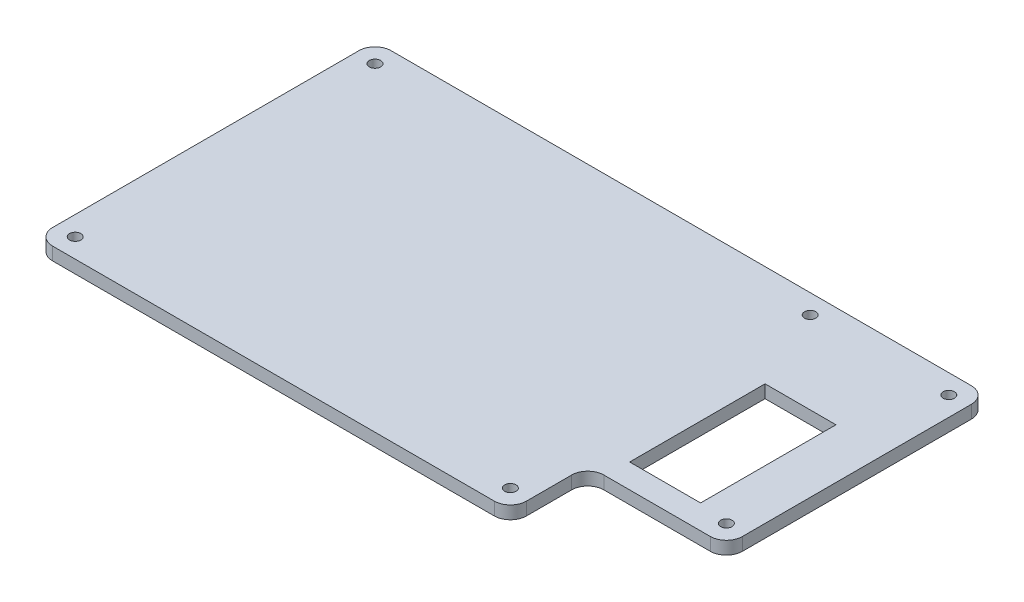
ISO-10303-21;
HEADER;
FILE_DESCRIPTION(('STEP AP214'),'2;1');
FILE_NAME('part.step','',(''),(''),'','','');
FILE_SCHEMA(('AUTOMOTIVE_DESIGN { 1 0 10303 214 1 1 1 1 }'));
ENDSEC;
DATA;
#1=APPLICATION_CONTEXT('core data for automotive mechanical design processes');
#2=APPLICATION_PROTOCOL_DEFINITION('international standard','automotive_design',2000,#1);
#3=PRODUCT_CONTEXT('',#1,'mechanical');
#4=PRODUCT('Part','Part','',(#3));
#5=PRODUCT_RELATED_PRODUCT_CATEGORY('part','',(#4));
#6=PRODUCT_DEFINITION_FORMATION('','',#4);
#7=PRODUCT_DEFINITION_CONTEXT('part definition',#1,'design');
#8=PRODUCT_DEFINITION('design','',#6,#7);
#9=PRODUCT_DEFINITION_SHAPE('','',#8);
#10=(LENGTH_UNIT() NAMED_UNIT(*) SI_UNIT(.MILLI.,.METRE.));
#11=(NAMED_UNIT(*) PLANE_ANGLE_UNIT() SI_UNIT($,.RADIAN.));
#12=(NAMED_UNIT(*) SI_UNIT($,.STERADIAN.) SOLID_ANGLE_UNIT());
#13=UNCERTAINTY_MEASURE_WITH_UNIT(LENGTH_MEASURE(1.E-05),#10,'distance_accuracy_value','');
#14=(GEOMETRIC_REPRESENTATION_CONTEXT(3) GLOBAL_UNCERTAINTY_ASSIGNED_CONTEXT((#13)) GLOBAL_UNIT_ASSIGNED_CONTEXT((#10,
#11,#12)) REPRESENTATION_CONTEXT('',''));
#15=CARTESIAN_POINT('',(0.,0.,0.));
#16=DIRECTION('',(0.,0.,1.));
#17=DIRECTION('',(1.,0.,0.));
#18=AXIS2_PLACEMENT_3D('',#15,#16,#17);
#19=CARTESIAN_POINT('',(0.,4.,0.));
#20=DIRECTION('',(0.,1.,0.));
#21=DIRECTION('',(0.,0.,1.));
#22=AXIS2_PLACEMENT_3D('',#19,#20,#21);
#23=PLANE('',#22);
#24=CARTESIAN_POINT('',(88.9999999999997,4.,-46.5));
#25=DIRECTION('',(0.,1.,0.));
#26=DIRECTION('',(0.,0.,1.));
#27=AXIS2_PLACEMENT_3D('',#24,#25,#26);
#28=CIRCLE('',#27,1.75);
#29=CARTESIAN_POINT('',(88.9999999999997,4.,-44.75));
#30=VERTEX_POINT('',#29);
#31=EDGE_CURVE('E183',#30,#30,#28,.T.);
#32=ORIENTED_EDGE('',*,*,#31,.F.);
#33=EDGE_LOOP('',(#32));
#34=FACE_BOUND('',#33,.T.);
#35=CARTESIAN_POINT('',(-89.0000000000003,4.,-46.5));
#36=DIRECTION('',(0.,1.,0.));
#37=DIRECTION('',(0.,0.,1.));
#38=AXIS2_PLACEMENT_3D('',#35,#36,#37);
#39=CIRCLE('',#38,1.75);
#40=CARTESIAN_POINT('',(-89.0000000000003,4.,-44.75));
#41=VERTEX_POINT('',#40);
#42=EDGE_CURVE('E194',#41,#41,#39,.T.);
#43=ORIENTED_EDGE('',*,*,#42,.F.);
#44=EDGE_LOOP('',(#43));
#45=FACE_BOUND('',#44,.T.);
#46=CARTESIAN_POINT('',(46.,4.,46.5));
#47=DIRECTION('',(0.,1.,0.));
#48=DIRECTION('',(0.,0.,1.));
#49=AXIS2_PLACEMENT_3D('',#46,#47,#48);
#50=CIRCLE('',#49,1.75);
#51=CARTESIAN_POINT('',(46.,4.,48.25));
#52=VERTEX_POINT('',#51);
#53=EDGE_CURVE('E206',#52,#52,#50,.T.);
#54=ORIENTED_EDGE('',*,*,#53,.F.);
#55=EDGE_LOOP('',(#54));
#56=FACE_BOUND('',#55,.T.);
#57=DIRECTION('',(1.,0.,0.));
#58=VECTOR('',#57,1.);
#59=CARTESIAN_POINT('',(-95.,4.,52.5));
#60=LINE('',#59,#58);
#61=CARTESIAN_POINT('',(-90.,4.,52.5));
#62=VERTEX_POINT('',#61);
#63=CARTESIAN_POINT('',(46.9999999999999,4.,52.5));
#64=VERTEX_POINT('',#63);
#65=EDGE_CURVE('E221',#62,#64,#60,.T.);
#66=ORIENTED_EDGE('',*,*,#65,.T.);
#67=CARTESIAN_POINT('',(47.,4.,47.5));
#68=DIRECTION('',(0.,1.,0.));
#69=DIRECTION('',(0.,0.,1.));
#70=AXIS2_PLACEMENT_3D('',#67,#68,#69);
#71=CIRCLE('',#70,5.);
#72=CARTESIAN_POINT('',(52.,4.,47.5));
#73=VERTEX_POINT('',#72);
#74=EDGE_CURVE('E282',#64,#73,#71,.T.);
#75=ORIENTED_EDGE('',*,*,#74,.T.);
#76=DIRECTION('',(0.,0.,-1.));
#77=VECTOR('',#76,1.);
#78=CARTESIAN_POINT('',(52.,4.,52.5));
#79=LINE('',#78,#77);
#80=CARTESIAN_POINT('',(52.,4.,33.5));
#81=VERTEX_POINT('',#80);
#82=EDGE_CURVE('E225',#73,#81,#79,.T.);
#83=ORIENTED_EDGE('',*,*,#82,.T.);
#84=CARTESIAN_POINT('',(57.,4.,33.5));
#85=DIRECTION('',(0.,1.,0.));
#86=DIRECTION('',(0.,0.,1.));
#87=AXIS2_PLACEMENT_3D('',#84,#85,#86);
#88=CIRCLE('',#87,5.);
#89=CARTESIAN_POINT('',(57.,4.,28.5));
#90=VERTEX_POINT('',#89);
#91=EDGE_CURVE('E11',#81,#90,#88,.F.);
#92=ORIENTED_EDGE('',*,*,#91,.T.);
#93=DIRECTION('',(1.,0.,0.));
#94=VECTOR('',#93,1.);
#95=CARTESIAN_POINT('',(52.,4.,28.5));
#96=LINE('',#95,#94);
#97=CARTESIAN_POINT('',(90.,4.,28.5));
#98=VERTEX_POINT('',#97);
#99=EDGE_CURVE('E228',#90,#98,#96,.T.);
#100=ORIENTED_EDGE('',*,*,#99,.T.);
#101=CARTESIAN_POINT('',(90.,4.,23.5));
#102=DIRECTION('',(0.,1.,0.));
#103=DIRECTION('',(0.,0.,1.));
#104=AXIS2_PLACEMENT_3D('',#101,#102,#103);
#105=CIRCLE('',#104,5.);
#106=CARTESIAN_POINT('',(95.,4.,23.5));
#107=VERTEX_POINT('',#106);
#108=EDGE_CURVE('E280',#98,#107,#105,.T.);
#109=ORIENTED_EDGE('',*,*,#108,.T.);
#110=DIRECTION('',(0.,0.,-1.));
#111=VECTOR('',#110,1.);
#112=CARTESIAN_POINT('',(95.,4.,-52.5));
#113=LINE('',#112,#111);
#114=CARTESIAN_POINT('',(95.,4.,-47.5));
#115=VERTEX_POINT('',#114);
#116=EDGE_CURVE('E231',#107,#115,#113,.T.);
#117=ORIENTED_EDGE('',*,*,#116,.T.);
#118=CARTESIAN_POINT('',(90.,4.,-47.5));
#119=DIRECTION('',(0.,1.,0.));
#120=DIRECTION('',(0.,0.,1.));
#121=AXIS2_PLACEMENT_3D('',#118,#119,#120);
#122=CIRCLE('',#121,5.);
#123=CARTESIAN_POINT('',(90.,4.,-52.5));
#124=VERTEX_POINT('',#123);
#125=EDGE_CURVE('E57',#115,#124,#122,.T.);
#126=ORIENTED_EDGE('',*,*,#125,.T.);
#127=DIRECTION('',(-1.,0.,0.));
#128=VECTOR('',#127,1.);
#129=CARTESIAN_POINT('',(-95.,4.,-52.5));
#130=LINE('',#129,#128);
#131=CARTESIAN_POINT('',(-90.,4.,-52.5));
#132=VERTEX_POINT('',#131);
#133=EDGE_CURVE('E233',#124,#132,#130,.T.);
#134=ORIENTED_EDGE('',*,*,#133,.T.);
#135=CARTESIAN_POINT('',(-90.,4.,-47.5));
#136=DIRECTION('',(0.,1.,0.));
#137=DIRECTION('',(0.,0.,1.));
#138=AXIS2_PLACEMENT_3D('',#135,#136,#137);
#139=CIRCLE('',#138,5.);
#140=CARTESIAN_POINT('',(-95.,4.,-47.5));
#141=VERTEX_POINT('',#140);
#142=EDGE_CURVE('E278',#132,#141,#139,.T.);
#143=ORIENTED_EDGE('',*,*,#142,.T.);
#144=DIRECTION('',(0.,0.,1.));
#145=VECTOR('',#144,1.);
#146=CARTESIAN_POINT('',(-95.,4.,-52.5));
#147=LINE('',#146,#145);
#148=CARTESIAN_POINT('',(-95.,4.,47.5));
#149=VERTEX_POINT('',#148);
#150=EDGE_CURVE('E218',#141,#149,#147,.T.);
#151=ORIENTED_EDGE('',*,*,#150,.T.);
#152=CARTESIAN_POINT('',(-90.,4.,47.5));
#153=DIRECTION('',(0.,1.,0.));
#154=DIRECTION('',(0.,0.,1.));
#155=AXIS2_PLACEMENT_3D('',#152,#153,#154);
#156=CIRCLE('',#155,5.);
#157=EDGE_CURVE('E275',#149,#62,#156,.T.);
#158=ORIENTED_EDGE('',*,*,#157,.T.);
#159=EDGE_LOOP('',(#66,#75,#83,#92,#100,#109,#117,#126,#134,#143,#151,#158));
#160=FACE_BOUND('',#159,.T.);
#161=CARTESIAN_POINT('',(-89.,4.,46.5));
#162=DIRECTION('',(0.,1.,0.));
#163=DIRECTION('',(0.,0.,1.));
#164=AXIS2_PLACEMENT_3D('',#161,#162,#163);
#165=CIRCLE('',#164,1.75);
#166=CARTESIAN_POINT('',(-89.,4.,48.25));
#167=VERTEX_POINT('',#166);
#168=EDGE_CURVE('E212',#167,#167,#165,.T.);
#169=ORIENTED_EDGE('',*,*,#168,.F.);
#170=EDGE_LOOP('',(#169));
#171=FACE_BOUND('',#170,.T.);
#172=CARTESIAN_POINT('',(45.9999999999997,4.,-46.5));
#173=DIRECTION('',(0.,1.,0.));
#174=DIRECTION('',(0.,0.,1.));
#175=AXIS2_PLACEMENT_3D('',#172,#173,#174);
#176=CIRCLE('',#175,1.75);
#177=CARTESIAN_POINT('',(45.9999999999997,4.,-44.75));
#178=VERTEX_POINT('',#177);
#179=EDGE_CURVE('E200',#178,#178,#176,.T.);
#180=ORIENTED_EDGE('',*,*,#179,.F.);
#181=EDGE_LOOP('',(#180));
#182=FACE_BOUND('',#181,.T.);
#183=DIRECTION('',(-1.,0.,0.));
#184=VECTOR('',#183,1.);
#185=CARTESIAN_POINT('',(57.5,4.,-21.));
#186=LINE('',#185,#184);
#187=CARTESIAN_POINT('',(79.5,4.,-21.));
#188=VERTEX_POINT('',#187);
#189=CARTESIAN_POINT('',(57.5,4.,-21.));
#190=VERTEX_POINT('',#189);
#191=EDGE_CURVE('E160',#188,#190,#186,.T.);
#192=ORIENTED_EDGE('',*,*,#191,.F.);
#193=DIRECTION('',(0.,0.,-1.));
#194=VECTOR('',#193,1.);
#195=CARTESIAN_POINT('',(79.5,4.,21.));
#196=LINE('',#195,#194);
#197=CARTESIAN_POINT('',(79.5,4.,21.));
#198=VERTEX_POINT('',#197);
#199=EDGE_CURVE('E150',#198,#188,#196,.T.);
#200=ORIENTED_EDGE('',*,*,#199,.F.);
#201=DIRECTION('',(1.,0.,0.));
#202=VECTOR('',#201,1.);
#203=CARTESIAN_POINT('',(57.5,4.,21.));
#204=LINE('',#203,#202);
#205=CARTESIAN_POINT('',(57.5,4.,21.));
#206=VERTEX_POINT('',#205);
#207=EDGE_CURVE('E176',#206,#198,#204,.T.);
#208=ORIENTED_EDGE('',*,*,#207,.F.);
#209=DIRECTION('',(0.,0.,1.));
#210=VECTOR('',#209,1.);
#211=CARTESIAN_POINT('',(57.5,4.,21.));
#212=LINE('',#211,#210);
#213=EDGE_CURVE('E174',#190,#206,#212,.T.);
#214=ORIENTED_EDGE('',*,*,#213,.F.);
#215=EDGE_LOOP('',(#192,#200,#208,#214));
#216=FACE_BOUND('',#215,.T.);
#217=CARTESIAN_POINT('',(89.0000000000004,4.,22.5));
#218=DIRECTION('',(0.,1.,0.));
#219=DIRECTION('',(0.,0.,1.));
#220=AXIS2_PLACEMENT_3D('',#217,#218,#219);
#221=CIRCLE('',#220,1.75);
#222=CARTESIAN_POINT('',(89.0000000000004,4.,24.25));
#223=VERTEX_POINT('',#222);
#224=EDGE_CURVE('E563',#223,#223,#221,.T.);
#225=ORIENTED_EDGE('',*,*,#224,.F.);
#226=EDGE_LOOP('',(#225));
#227=FACE_BOUND('',#226,.T.);
#228=ADVANCED_FACE('F35',(#34,#45,#56,#160,#171,#182,#216,#227),#23,.T.);
#229=CARTESIAN_POINT('',(0.,0.,0.));
#230=DIRECTION('',(0.,1.,0.));
#231=DIRECTION('',(0.,0.,1.));
#232=AXIS2_PLACEMENT_3D('',#229,#230,#231);
#233=PLANE('',#232);
#234=CARTESIAN_POINT('',(88.9999999999997,0.,-46.5));
#235=DIRECTION('',(0.,1.,0.));
#236=DIRECTION('',(0.,0.,1.));
#237=AXIS2_PLACEMENT_3D('',#234,#235,#236);
#238=CIRCLE('',#237,1.75);
#239=CARTESIAN_POINT('',(88.9999999999997,0.,-44.75));
#240=VERTEX_POINT('',#239);
#241=EDGE_CURVE('E569',#240,#240,#238,.T.);
#242=ORIENTED_EDGE('',*,*,#241,.T.);
#243=EDGE_LOOP('',(#242));
#244=FACE_BOUND('',#243,.T.);
#245=CARTESIAN_POINT('',(-89.0000000000003,0.,-46.5));
#246=DIRECTION('',(0.,1.,0.));
#247=DIRECTION('',(0.,0.,1.));
#248=AXIS2_PLACEMENT_3D('',#245,#246,#247);
#249=CIRCLE('',#248,1.75);
#250=CARTESIAN_POINT('',(-89.0000000000003,0.,-44.75));
#251=VERTEX_POINT('',#250);
#252=EDGE_CURVE('E168',#251,#251,#249,.T.);
#253=ORIENTED_EDGE('',*,*,#252,.T.);
#254=EDGE_LOOP('',(#253));
#255=FACE_BOUND('',#254,.T.);
#256=CARTESIAN_POINT('',(46.,0.,46.5));
#257=DIRECTION('',(0.,1.,0.));
#258=DIRECTION('',(0.,0.,1.));
#259=AXIS2_PLACEMENT_3D('',#256,#257,#258);
#260=CIRCLE('',#259,1.75);
#261=CARTESIAN_POINT('',(46.,0.,48.25));
#262=VERTEX_POINT('',#261);
#263=EDGE_CURVE('E203',#262,#262,#260,.T.);
#264=ORIENTED_EDGE('',*,*,#263,.T.);
#265=EDGE_LOOP('',(#264));
#266=FACE_BOUND('',#265,.T.);
#267=DIRECTION('',(0.,0.,-1.));
#268=VECTOR('',#267,1.);
#269=CARTESIAN_POINT('',(52.,0.,52.5));
#270=LINE('',#269,#268);
#271=CARTESIAN_POINT('',(52.,0.,47.5));
#272=VERTEX_POINT('',#271);
#273=CARTESIAN_POINT('',(52.,0.,33.5));
#274=VERTEX_POINT('',#273);
#275=EDGE_CURVE('E241',#272,#274,#270,.T.);
#276=ORIENTED_EDGE('',*,*,#275,.F.);
#277=CARTESIAN_POINT('',(47.,0.,47.5));
#278=DIRECTION('',(0.,1.,0.));
#279=DIRECTION('',(0.,0.,1.));
#280=AXIS2_PLACEMENT_3D('',#277,#278,#279);
#281=CIRCLE('',#280,5.);
#282=CARTESIAN_POINT('',(46.9999999999999,0.,52.5));
#283=VERTEX_POINT('',#282);
#284=EDGE_CURVE('E268',#272,#283,#281,.F.);
#285=ORIENTED_EDGE('',*,*,#284,.T.);
#286=DIRECTION('',(1.,0.,0.));
#287=VECTOR('',#286,1.);
#288=CARTESIAN_POINT('',(-95.,0.,52.5));
#289=LINE('',#288,#287);
#290=CARTESIAN_POINT('',(-90.,0.,52.5));
#291=VERTEX_POINT('',#290);
#292=EDGE_CURVE('E238',#291,#283,#289,.T.);
#293=ORIENTED_EDGE('',*,*,#292,.F.);
#294=CARTESIAN_POINT('',(-90.,0.,47.5));
#295=DIRECTION('',(0.,1.,0.));
#296=DIRECTION('',(0.,0.,1.));
#297=AXIS2_PLACEMENT_3D('',#294,#295,#296);
#298=CIRCLE('',#297,5.);
#299=CARTESIAN_POINT('',(-95.,0.,47.5));
#300=VERTEX_POINT('',#299);
#301=EDGE_CURVE('E260',#291,#300,#298,.F.);
#302=ORIENTED_EDGE('',*,*,#301,.T.);
#303=DIRECTION('',(0.,0.,1.));
#304=VECTOR('',#303,1.);
#305=CARTESIAN_POINT('',(-95.,0.,-52.5));
#306=LINE('',#305,#304);
#307=CARTESIAN_POINT('',(-95.,0.,-47.5));
#308=VERTEX_POINT('',#307);
#309=EDGE_CURVE('E215',#308,#300,#306,.T.);
#310=ORIENTED_EDGE('',*,*,#309,.F.);
#311=CARTESIAN_POINT('',(-90.,0.,-47.5));
#312=DIRECTION('',(0.,1.,0.));
#313=DIRECTION('',(0.,0.,1.));
#314=AXIS2_PLACEMENT_3D('',#311,#312,#313);
#315=CIRCLE('',#314,5.);
#316=CARTESIAN_POINT('',(-90.,0.,-52.5));
#317=VERTEX_POINT('',#316);
#318=EDGE_CURVE('E264',#308,#317,#315,.F.);
#319=ORIENTED_EDGE('',*,*,#318,.T.);
#320=DIRECTION('',(-1.,0.,0.));
#321=VECTOR('',#320,1.);
#322=CARTESIAN_POINT('',(-95.,0.,-52.5));
#323=LINE('',#322,#321);
#324=CARTESIAN_POINT('',(90.,0.,-52.5));
#325=VERTEX_POINT('',#324);
#326=EDGE_CURVE('E222',#325,#317,#323,.T.);
#327=ORIENTED_EDGE('',*,*,#326,.F.);
#328=CARTESIAN_POINT('',(90.,0.,-47.5));
#329=DIRECTION('',(0.,1.,0.));
#330=DIRECTION('',(0.,0.,1.));
#331=AXIS2_PLACEMENT_3D('',#328,#329,#330);
#332=CIRCLE('',#331,5.);
#333=CARTESIAN_POINT('',(95.,0.,-47.5));
#334=VERTEX_POINT('',#333);
#335=EDGE_CURVE('E262',#325,#334,#332,.F.);
#336=ORIENTED_EDGE('',*,*,#335,.T.);
#337=DIRECTION('',(0.,0.,-1.));
#338=VECTOR('',#337,1.);
#339=CARTESIAN_POINT('',(95.,0.,-52.5));
#340=LINE('',#339,#338);
#341=CARTESIAN_POINT('',(95.,0.,23.5));
#342=VERTEX_POINT('',#341);
#343=EDGE_CURVE('E247',#342,#334,#340,.T.);
#344=ORIENTED_EDGE('',*,*,#343,.F.);
#345=CARTESIAN_POINT('',(90.,0.,23.5));
#346=DIRECTION('',(0.,1.,0.));
#347=DIRECTION('',(0.,0.,1.));
#348=AXIS2_PLACEMENT_3D('',#345,#346,#347);
#349=CIRCLE('',#348,5.);
#350=CARTESIAN_POINT('',(90.,0.,28.5));
#351=VERTEX_POINT('',#350);
#352=EDGE_CURVE('E266',#342,#351,#349,.F.);
#353=ORIENTED_EDGE('',*,*,#352,.T.);
#354=DIRECTION('',(1.,0.,0.));
#355=VECTOR('',#354,1.);
#356=CARTESIAN_POINT('',(52.,0.,28.5));
#357=LINE('',#356,#355);
#358=CARTESIAN_POINT('',(57.,0.,28.5));
#359=VERTEX_POINT('',#358);
#360=EDGE_CURVE('E244',#359,#351,#357,.T.);
#361=ORIENTED_EDGE('',*,*,#360,.F.);
#362=CARTESIAN_POINT('',(57.,0.,33.5));
#363=DIRECTION('',(0.,1.,0.));
#364=DIRECTION('',(0.,0.,1.));
#365=AXIS2_PLACEMENT_3D('',#362,#363,#364);
#366=CIRCLE('',#365,5.);
#367=EDGE_CURVE('E43',#359,#274,#366,.T.);
#368=ORIENTED_EDGE('',*,*,#367,.T.);
#369=EDGE_LOOP('',(#276,#285,#293,#302,#310,#319,#327,#336,#344,#353,#361,#368));
#370=FACE_BOUND('',#369,.T.);
#371=CARTESIAN_POINT('',(-89.,0.,46.5));
#372=DIRECTION('',(0.,1.,0.));
#373=DIRECTION('',(0.,0.,1.));
#374=AXIS2_PLACEMENT_3D('',#371,#372,#373);
#375=CIRCLE('',#374,1.75);
#376=CARTESIAN_POINT('',(-89.,0.,48.25));
#377=VERTEX_POINT('',#376);
#378=EDGE_CURVE('E209',#377,#377,#375,.T.);
#379=ORIENTED_EDGE('',*,*,#378,.T.);
#380=EDGE_LOOP('',(#379));
#381=FACE_BOUND('',#380,.T.);
#382=CARTESIAN_POINT('',(45.9999999999997,0.,-46.5));
#383=DIRECTION('',(0.,1.,0.));
#384=DIRECTION('',(0.,0.,1.));
#385=AXIS2_PLACEMENT_3D('',#382,#383,#384);
#386=CIRCLE('',#385,1.75);
#387=CARTESIAN_POINT('',(45.9999999999997,0.,-44.75));
#388=VERTEX_POINT('',#387);
#389=EDGE_CURVE('E197',#388,#388,#386,.T.);
#390=ORIENTED_EDGE('',*,*,#389,.T.);
#391=EDGE_LOOP('',(#390));
#392=FACE_BOUND('',#391,.T.);
#393=DIRECTION('',(0.,0.,-1.));
#394=VECTOR('',#393,1.);
#395=CARTESIAN_POINT('',(79.5,0.,21.));
#396=LINE('',#395,#394);
#397=CARTESIAN_POINT('',(79.5,0.,21.));
#398=VERTEX_POINT('',#397);
#399=CARTESIAN_POINT('',(79.5,0.,-21.));
#400=VERTEX_POINT('',#399);
#401=EDGE_CURVE('E181',#398,#400,#396,.T.);
#402=ORIENTED_EDGE('',*,*,#401,.T.);
#403=DIRECTION('',(-1.,0.,0.));
#404=VECTOR('',#403,1.);
#405=CARTESIAN_POINT('',(57.5,0.,-21.));
#406=LINE('',#405,#404);
#407=CARTESIAN_POINT('',(57.5,0.,-21.));
#408=VERTEX_POINT('',#407);
#409=EDGE_CURVE('E167',#400,#408,#406,.T.);
#410=ORIENTED_EDGE('',*,*,#409,.T.);
#411=DIRECTION('',(0.,0.,1.));
#412=VECTOR('',#411,1.);
#413=CARTESIAN_POINT('',(57.5,0.,21.));
#414=LINE('',#413,#412);
#415=CARTESIAN_POINT('',(57.5,0.,21.));
#416=VERTEX_POINT('',#415);
#417=EDGE_CURVE('E185',#408,#416,#414,.T.);
#418=ORIENTED_EDGE('',*,*,#417,.T.);
#419=DIRECTION('',(1.,0.,0.));
#420=VECTOR('',#419,1.);
#421=CARTESIAN_POINT('',(57.5,0.,21.));
#422=LINE('',#421,#420);
#423=EDGE_CURVE('E161',#416,#398,#422,.T.);
#424=ORIENTED_EDGE('',*,*,#423,.T.);
#425=EDGE_LOOP('',(#402,#410,#418,#424));
#426=FACE_BOUND('',#425,.T.);
#427=CARTESIAN_POINT('',(89.0000000000004,0.,22.5));
#428=DIRECTION('',(0.,1.,0.));
#429=DIRECTION('',(0.,0.,1.));
#430=AXIS2_PLACEMENT_3D('',#427,#428,#429);
#431=CIRCLE('',#430,1.75);
#432=CARTESIAN_POINT('',(89.0000000000004,0.,24.25));
#433=VERTEX_POINT('',#432);
#434=EDGE_CURVE('E566',#433,#433,#431,.T.);
#435=ORIENTED_EDGE('',*,*,#434,.T.);
#436=EDGE_LOOP('',(#435));
#437=FACE_BOUND('',#436,.T.);
#438=ADVANCED_FACE('F300',(#244,#255,#266,#370,#381,#392,#426,#437),#233,.F.);
#439=CARTESIAN_POINT('',(-95.,4.,-52.5));
#440=DIRECTION('',(1.,0.,0.));
#441=DIRECTION('',(0.,0.,-1.));
#442=AXIS2_PLACEMENT_3D('',#439,#440,#441);
#443=PLANE('',#442);
#444=ORIENTED_EDGE('',*,*,#150,.F.);
#445=DIRECTION('',(0.,-1.,0.));
#446=VECTOR('',#445,1.);
#447=CARTESIAN_POINT('',(-95.,4.,-47.5));
#448=LINE('',#447,#446);
#449=EDGE_CURVE('E291',#141,#308,#448,.T.);
#450=ORIENTED_EDGE('',*,*,#449,.T.);
#451=ORIENTED_EDGE('',*,*,#309,.T.);
#452=DIRECTION('',(0.,-1.,0.));
#453=VECTOR('',#452,1.);
#454=CARTESIAN_POINT('',(-95.,4.,47.5));
#455=LINE('',#454,#453);
#456=EDGE_CURVE('E289',#300,#149,#455,.F.);
#457=ORIENTED_EDGE('',*,*,#456,.T.);
#458=EDGE_LOOP('',(#444,#450,#451,#457));
#459=FACE_BOUND('',#458,.T.);
#460=ADVANCED_FACE('F337',(#459),#443,.F.);
#461=CARTESIAN_POINT('',(-95.,4.,52.5));
#462=DIRECTION('',(0.,0.,-1.));
#463=DIRECTION('',(-1.,0.,0.));
#464=AXIS2_PLACEMENT_3D('',#461,#462,#463);
#465=PLANE('',#464);
#466=ORIENTED_EDGE('',*,*,#292,.T.);
#467=DIRECTION('',(0.,-1.,0.));
#468=VECTOR('',#467,1.);
#469=CARTESIAN_POINT('',(47.,4.,52.5));
#470=LINE('',#469,#468);
#471=EDGE_CURVE('E273',#283,#64,#470,.F.);
#472=ORIENTED_EDGE('',*,*,#471,.T.);
#473=ORIENTED_EDGE('',*,*,#65,.F.);
#474=DIRECTION('',(0.,-1.,0.));
#475=VECTOR('',#474,1.);
#476=CARTESIAN_POINT('',(-90.,4.,52.5));
#477=LINE('',#476,#475);
#478=EDGE_CURVE('E270',#62,#291,#477,.T.);
#479=ORIENTED_EDGE('',*,*,#478,.T.);
#480=EDGE_LOOP('',(#466,#472,#473,#479));
#481=FACE_BOUND('',#480,.T.);
#482=ADVANCED_FACE('F345',(#481),#465,.F.);
#483=CARTESIAN_POINT('',(52.,4.,52.5));
#484=DIRECTION('',(-1.,0.,0.));
#485=DIRECTION('',(0.,0.,1.));
#486=AXIS2_PLACEMENT_3D('',#483,#484,#485);
#487=PLANE('',#486);
#488=ORIENTED_EDGE('',*,*,#275,.T.);
#489=DIRECTION('',(0.,-1.,0.));
#490=VECTOR('',#489,1.);
#491=CARTESIAN_POINT('',(52.,4.,33.5));
#492=LINE('',#491,#490);
#493=EDGE_CURVE('E258',#274,#81,#492,.F.);
#494=ORIENTED_EDGE('',*,*,#493,.T.);
#495=ORIENTED_EDGE('',*,*,#82,.F.);
#496=DIRECTION('',(0.,-1.,0.));
#497=VECTOR('',#496,1.);
#498=CARTESIAN_POINT('',(52.,4.,47.5));
#499=LINE('',#498,#497);
#500=EDGE_CURVE('E255',#73,#272,#499,.T.);
#501=ORIENTED_EDGE('',*,*,#500,.T.);
#502=EDGE_LOOP('',(#488,#494,#495,#501));
#503=FACE_BOUND('',#502,.T.);
#504=ADVANCED_FACE('F306',(#503),#487,.F.);
#505=CARTESIAN_POINT('',(52.,4.,28.5));
#506=DIRECTION('',(0.,0.,-1.));
#507=DIRECTION('',(-1.,0.,0.));
#508=AXIS2_PLACEMENT_3D('',#505,#506,#507);
#509=PLANE('',#508);
#510=ORIENTED_EDGE('',*,*,#99,.F.);
#511=DIRECTION('',(0.,-1.,0.));
#512=VECTOR('',#511,1.);
#513=CARTESIAN_POINT('',(57.,0.,28.5));
#514=LINE('',#513,#512);
#515=EDGE_CURVE('E252',#90,#359,#514,.T.);
#516=ORIENTED_EDGE('',*,*,#515,.T.);
#517=ORIENTED_EDGE('',*,*,#360,.T.);
#518=DIRECTION('',(0.,-1.,0.));
#519=VECTOR('',#518,1.);
#520=CARTESIAN_POINT('',(90.,4.,28.5));
#521=LINE('',#520,#519);
#522=EDGE_CURVE('E235',#351,#98,#521,.F.);
#523=ORIENTED_EDGE('',*,*,#522,.T.);
#524=EDGE_LOOP('',(#510,#516,#517,#523));
#525=FACE_BOUND('',#524,.T.);
#526=ADVANCED_FACE('F315',(#525),#509,.F.);
#527=CARTESIAN_POINT('',(95.,4.,-52.5));
#528=DIRECTION('',(-1.,0.,0.));
#529=DIRECTION('',(0.,0.,1.));
#530=AXIS2_PLACEMENT_3D('',#527,#528,#529);
#531=PLANE('',#530);
#532=ORIENTED_EDGE('',*,*,#116,.F.);
#533=DIRECTION('',(0.,-1.,0.));
#534=VECTOR('',#533,1.);
#535=CARTESIAN_POINT('',(95.,4.,23.5));
#536=LINE('',#535,#534);
#537=EDGE_CURVE('E286',#107,#342,#536,.T.);
#538=ORIENTED_EDGE('',*,*,#537,.T.);
#539=ORIENTED_EDGE('',*,*,#343,.T.);
#540=DIRECTION('',(0.,-1.,0.));
#541=VECTOR('',#540,1.);
#542=CARTESIAN_POINT('',(95.,4.,-47.5));
#543=LINE('',#542,#541);
#544=EDGE_CURVE('E284',#334,#115,#543,.F.);
#545=ORIENTED_EDGE('',*,*,#544,.T.);
#546=EDGE_LOOP('',(#532,#538,#539,#545));
#547=FACE_BOUND('',#546,.T.);
#548=ADVANCED_FACE('F322',(#547),#531,.F.);
#549=CARTESIAN_POINT('',(-95.,4.,-52.5));
#550=DIRECTION('',(0.,0.,1.));
#551=DIRECTION('',(1.,0.,0.));
#552=AXIS2_PLACEMENT_3D('',#549,#550,#551);
#553=PLANE('',#552);
#554=ORIENTED_EDGE('',*,*,#326,.T.);
#555=DIRECTION('',(0.,-1.,0.));
#556=VECTOR('',#555,1.);
#557=CARTESIAN_POINT('',(-90.,4.,-52.5));
#558=LINE('',#557,#556);
#559=EDGE_CURVE('E50',#317,#132,#558,.F.);
#560=ORIENTED_EDGE('',*,*,#559,.T.);
#561=ORIENTED_EDGE('',*,*,#133,.F.);
#562=DIRECTION('',(0.,-1.,0.));
#563=VECTOR('',#562,1.);
#564=CARTESIAN_POINT('',(90.,4.,-52.5));
#565=LINE('',#564,#563);
#566=EDGE_CURVE('E294',#124,#325,#565,.T.);
#567=ORIENTED_EDGE('',*,*,#566,.T.);
#568=EDGE_LOOP('',(#554,#560,#561,#567));
#569=FACE_BOUND('',#568,.T.);
#570=ADVANCED_FACE('F329',(#569),#553,.F.);
#571=CARTESIAN_POINT('',(-89.,4.,46.5));
#572=DIRECTION('',(0.,-1.,0.));
#573=DIRECTION('',(0.,0.,-1.));
#574=AXIS2_PLACEMENT_3D('',#571,#572,#573);
#575=CYLINDRICAL_SURFACE('',#574,1.75);
#576=ORIENTED_EDGE('',*,*,#168,.T.);
#577=EDGE_LOOP('',(#576));
#578=FACE_BOUND('',#577,.T.);
#579=ORIENTED_EDGE('',*,*,#378,.F.);
#580=EDGE_LOOP('',(#579));
#581=FACE_BOUND('',#580,.T.);
#582=ADVANCED_FACE('F370',(#578,#581),#575,.F.);
#583=CARTESIAN_POINT('',(46.,4.,46.5));
#584=DIRECTION('',(0.,-1.,0.));
#585=DIRECTION('',(0.,0.,-1.));
#586=AXIS2_PLACEMENT_3D('',#583,#584,#585);
#587=CYLINDRICAL_SURFACE('',#586,1.75);
#588=ORIENTED_EDGE('',*,*,#53,.T.);
#589=EDGE_LOOP('',(#588));
#590=FACE_BOUND('',#589,.T.);
#591=ORIENTED_EDGE('',*,*,#263,.F.);
#592=EDGE_LOOP('',(#591));
#593=FACE_BOUND('',#592,.T.);
#594=ADVANCED_FACE('F415',(#590,#593),#587,.F.);
#595=CARTESIAN_POINT('',(45.9999999999997,4.,-46.5));
#596=DIRECTION('',(0.,-1.,0.));
#597=DIRECTION('',(0.,0.,-1.));
#598=AXIS2_PLACEMENT_3D('',#595,#596,#597);
#599=CYLINDRICAL_SURFACE('',#598,1.75);
#600=ORIENTED_EDGE('',*,*,#179,.T.);
#601=EDGE_LOOP('',(#600));
#602=FACE_BOUND('',#601,.T.);
#603=ORIENTED_EDGE('',*,*,#389,.F.);
#604=EDGE_LOOP('',(#603));
#605=FACE_BOUND('',#604,.T.);
#606=ADVANCED_FACE('F422',(#602,#605),#599,.F.);
#607=CARTESIAN_POINT('',(-89.0000000000003,4.,-46.5));
#608=DIRECTION('',(0.,-1.,0.));
#609=DIRECTION('',(0.,0.,-1.));
#610=AXIS2_PLACEMENT_3D('',#607,#608,#609);
#611=CYLINDRICAL_SURFACE('',#610,1.75);
#612=ORIENTED_EDGE('',*,*,#42,.T.);
#613=EDGE_LOOP('',(#612));
#614=FACE_BOUND('',#613,.T.);
#615=ORIENTED_EDGE('',*,*,#252,.F.);
#616=EDGE_LOOP('',(#615));
#617=FACE_BOUND('',#616,.T.);
#618=ADVANCED_FACE('F429',(#614,#617),#611,.F.);
#619=CARTESIAN_POINT('',(79.5,4.,21.));
#620=DIRECTION('',(-1.,0.,0.));
#621=DIRECTION('',(0.,0.,1.));
#622=AXIS2_PLACEMENT_3D('',#619,#620,#621);
#623=PLANE('',#622);
#624=ORIENTED_EDGE('',*,*,#401,.F.);
#625=DIRECTION('',(0.,-1.,0.));
#626=VECTOR('',#625,1.);
#627=CARTESIAN_POINT('',(79.5,4.,21.));
#628=LINE('',#627,#626);
#629=EDGE_CURVE('E156',#198,#398,#628,.T.);
#630=ORIENTED_EDGE('',*,*,#629,.F.);
#631=ORIENTED_EDGE('',*,*,#199,.T.);
#632=DIRECTION('',(0.,-1.,0.));
#633=VECTOR('',#632,1.);
#634=CARTESIAN_POINT('',(79.5,4.,-21.));
#635=LINE('',#634,#633);
#636=EDGE_CURVE('E153',#188,#400,#635,.T.);
#637=ORIENTED_EDGE('',*,*,#636,.T.);
#638=EDGE_LOOP('',(#624,#630,#631,#637));
#639=FACE_BOUND('',#638,.T.);
#640=ADVANCED_FACE('F152',(#639),#623,.T.);
#641=CARTESIAN_POINT('',(57.5,4.,-21.));
#642=DIRECTION('',(0.,0.,1.));
#643=DIRECTION('',(1.,0.,0.));
#644=AXIS2_PLACEMENT_3D('',#641,#642,#643);
#645=PLANE('',#644);
#646=ORIENTED_EDGE('',*,*,#409,.F.);
#647=ORIENTED_EDGE('',*,*,#636,.F.);
#648=ORIENTED_EDGE('',*,*,#191,.T.);
#649=DIRECTION('',(0.,-1.,0.));
#650=VECTOR('',#649,1.);
#651=CARTESIAN_POINT('',(57.5,4.,-21.));
#652=LINE('',#651,#650);
#653=EDGE_CURVE('E169',#190,#408,#652,.T.);
#654=ORIENTED_EDGE('',*,*,#653,.T.);
#655=EDGE_LOOP('',(#646,#647,#648,#654));
#656=FACE_BOUND('',#655,.T.);
#657=ADVANCED_FACE('F164',(#656),#645,.T.);
#658=CARTESIAN_POINT('',(57.5,4.,21.));
#659=DIRECTION('',(1.,0.,0.));
#660=DIRECTION('',(0.,0.,-1.));
#661=AXIS2_PLACEMENT_3D('',#658,#659,#660);
#662=PLANE('',#661);
#663=ORIENTED_EDGE('',*,*,#417,.F.);
#664=ORIENTED_EDGE('',*,*,#653,.F.);
#665=ORIENTED_EDGE('',*,*,#213,.T.);
#666=DIRECTION('',(0.,-1.,0.));
#667=VECTOR('',#666,1.);
#668=CARTESIAN_POINT('',(57.5,4.,21.));
#669=LINE('',#668,#667);
#670=EDGE_CURVE('E191',#206,#416,#669,.T.);
#671=ORIENTED_EDGE('',*,*,#670,.T.);
#672=EDGE_LOOP('',(#663,#664,#665,#671));
#673=FACE_BOUND('',#672,.T.);
#674=ADVANCED_FACE('F450',(#673),#662,.T.);
#675=CARTESIAN_POINT('',(57.5,4.,21.));
#676=DIRECTION('',(0.,0.,-1.));
#677=DIRECTION('',(-1.,0.,0.));
#678=AXIS2_PLACEMENT_3D('',#675,#676,#677);
#679=PLANE('',#678);
#680=ORIENTED_EDGE('',*,*,#423,.F.);
#681=ORIENTED_EDGE('',*,*,#670,.F.);
#682=ORIENTED_EDGE('',*,*,#207,.T.);
#683=ORIENTED_EDGE('',*,*,#629,.T.);
#684=EDGE_LOOP('',(#680,#681,#682,#683));
#685=FACE_BOUND('',#684,.T.);
#686=ADVANCED_FACE('F457',(#685),#679,.T.);
#687=CARTESIAN_POINT('',(88.9999999999997,4.,-46.5));
#688=DIRECTION('',(0.,-1.,0.));
#689=DIRECTION('',(0.,0.,-1.));
#690=AXIS2_PLACEMENT_3D('',#687,#688,#689);
#691=CYLINDRICAL_SURFACE('',#690,1.75);
#692=ORIENTED_EDGE('',*,*,#31,.T.);
#693=EDGE_LOOP('',(#692));
#694=FACE_BOUND('',#693,.T.);
#695=ORIENTED_EDGE('',*,*,#241,.F.);
#696=EDGE_LOOP('',(#695));
#697=FACE_BOUND('',#696,.T.);
#698=ADVANCED_FACE('F465',(#694,#697),#691,.F.);
#699=CARTESIAN_POINT('',(89.0000000000004,4.,22.5));
#700=DIRECTION('',(0.,-1.,0.));
#701=DIRECTION('',(0.,0.,-1.));
#702=AXIS2_PLACEMENT_3D('',#699,#700,#701);
#703=CYLINDRICAL_SURFACE('',#702,1.75);
#704=ORIENTED_EDGE('',*,*,#224,.T.);
#705=EDGE_LOOP('',(#704));
#706=FACE_BOUND('',#705,.T.);
#707=ORIENTED_EDGE('',*,*,#434,.F.);
#708=EDGE_LOOP('',(#707));
#709=FACE_BOUND('',#708,.T.);
#710=ADVANCED_FACE('F357',(#706,#709),#703,.F.);
#711=CARTESIAN_POINT('',(57.,4.,33.5));
#712=DIRECTION('',(0.,1.,0.));
#713=DIRECTION('',(0.,0.,1.));
#714=AXIS2_PLACEMENT_3D('',#711,#712,#713);
#715=CYLINDRICAL_SURFACE('',#714,5.);
#716=ORIENTED_EDGE('',*,*,#91,.F.);
#717=ORIENTED_EDGE('',*,*,#493,.F.);
#718=ORIENTED_EDGE('',*,*,#367,.F.);
#719=ORIENTED_EDGE('',*,*,#515,.F.);
#720=EDGE_LOOP('',(#716,#717,#718,#719));
#721=FACE_BOUND('',#720,.T.);
#722=ADVANCED_FACE('F310',(#721),#715,.F.);
#723=CARTESIAN_POINT('',(47.,4.,47.5));
#724=DIRECTION('',(0.,-1.,0.));
#725=DIRECTION('',(0.,0.,-1.));
#726=AXIS2_PLACEMENT_3D('',#723,#724,#725);
#727=CYLINDRICAL_SURFACE('',#726,5.);
#728=ORIENTED_EDGE('',*,*,#74,.F.);
#729=ORIENTED_EDGE('',*,*,#471,.F.);
#730=ORIENTED_EDGE('',*,*,#284,.F.);
#731=ORIENTED_EDGE('',*,*,#500,.F.);
#732=EDGE_LOOP('',(#728,#729,#730,#731));
#733=FACE_BOUND('',#732,.T.);
#734=ADVANCED_FACE('F349',(#733),#727,.T.);
#735=CARTESIAN_POINT('',(90.,4.,23.5));
#736=DIRECTION('',(0.,-1.,0.));
#737=DIRECTION('',(0.,0.,-1.));
#738=AXIS2_PLACEMENT_3D('',#735,#736,#737);
#739=CYLINDRICAL_SURFACE('',#738,5.);
#740=ORIENTED_EDGE('',*,*,#108,.F.);
#741=ORIENTED_EDGE('',*,*,#522,.F.);
#742=ORIENTED_EDGE('',*,*,#352,.F.);
#743=ORIENTED_EDGE('',*,*,#537,.F.);
#744=EDGE_LOOP('',(#740,#741,#742,#743));
#745=FACE_BOUND('',#744,.T.);
#746=ADVANCED_FACE('F318',(#745),#739,.T.);
#747=CARTESIAN_POINT('',(-90.,4.,-47.5));
#748=DIRECTION('',(0.,-1.,0.));
#749=DIRECTION('',(0.,0.,-1.));
#750=AXIS2_PLACEMENT_3D('',#747,#748,#749);
#751=CYLINDRICAL_SURFACE('',#750,5.);
#752=ORIENTED_EDGE('',*,*,#142,.F.);
#753=ORIENTED_EDGE('',*,*,#559,.F.);
#754=ORIENTED_EDGE('',*,*,#318,.F.);
#755=ORIENTED_EDGE('',*,*,#449,.F.);
#756=EDGE_LOOP('',(#752,#753,#754,#755));
#757=FACE_BOUND('',#756,.T.);
#758=ADVANCED_FACE('F334',(#757),#751,.T.);
#759=CARTESIAN_POINT('',(90.,4.,-47.5));
#760=DIRECTION('',(0.,-1.,0.));
#761=DIRECTION('',(0.,0.,-1.));
#762=AXIS2_PLACEMENT_3D('',#759,#760,#761);
#763=CYLINDRICAL_SURFACE('',#762,5.);
#764=ORIENTED_EDGE('',*,*,#125,.F.);
#765=ORIENTED_EDGE('',*,*,#544,.F.);
#766=ORIENTED_EDGE('',*,*,#335,.F.);
#767=ORIENTED_EDGE('',*,*,#566,.F.);
#768=EDGE_LOOP('',(#764,#765,#766,#767));
#769=FACE_BOUND('',#768,.T.);
#770=ADVANCED_FACE('F326',(#769),#763,.T.);
#771=CARTESIAN_POINT('',(-90.,4.,47.5));
#772=DIRECTION('',(0.,-1.,0.));
#773=DIRECTION('',(0.,0.,-1.));
#774=AXIS2_PLACEMENT_3D('',#771,#772,#773);
#775=CYLINDRICAL_SURFACE('',#774,5.);
#776=ORIENTED_EDGE('',*,*,#157,.F.);
#777=ORIENTED_EDGE('',*,*,#456,.F.);
#778=ORIENTED_EDGE('',*,*,#301,.F.);
#779=ORIENTED_EDGE('',*,*,#478,.F.);
#780=EDGE_LOOP('',(#776,#777,#778,#779));
#781=FACE_BOUND('',#780,.T.);
#782=ADVANCED_FACE('F37',(#781),#775,.T.);
#783=CLOSED_SHELL('',(#228,#438,#460,#482,#504,#526,#548,#570,#582,#594,#606,#618,#640,#657,
#674,#686,#698,#710,#722,#734,#746,#758,#770,#782));
#784=MANIFOLD_SOLID_BREP('B2',#783);
#785=ADVANCED_BREP_SHAPE_REPRESENTATION('',(#18,#784),#14);
#786=SHAPE_DEFINITION_REPRESENTATION(#9,#785);
ENDSEC;
END-ISO-10303-21;
